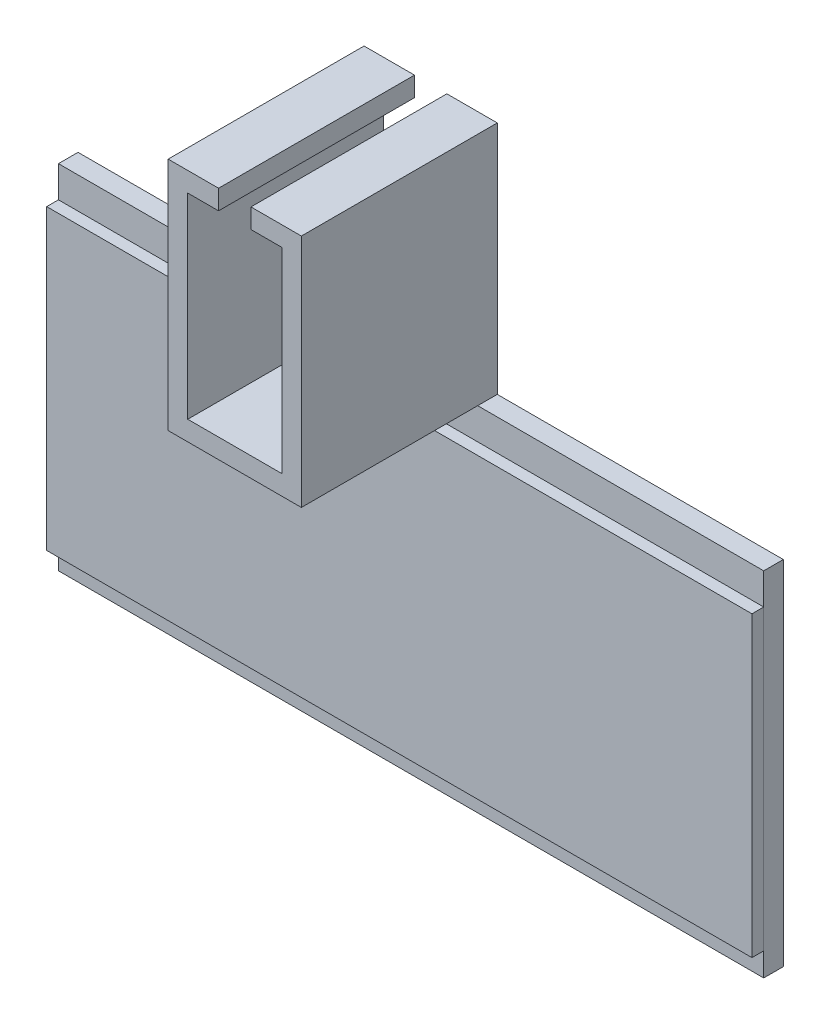
ISO-10303-21;
HEADER;
FILE_DESCRIPTION(('STEP AP214'),'2;1');
FILE_NAME('part.step','',(''),(''),'','','');
FILE_SCHEMA(('AUTOMOTIVE_DESIGN { 1 0 10303 214 1 1 1 1 }'));
ENDSEC;
DATA;
#1=APPLICATION_CONTEXT('core data for automotive mechanical design processes');
#2=APPLICATION_PROTOCOL_DEFINITION('international standard','automotive_design',2000,#1);
#3=PRODUCT_CONTEXT('',#1,'mechanical');
#4=PRODUCT('Part','Part','',(#3));
#5=PRODUCT_RELATED_PRODUCT_CATEGORY('part','',(#4));
#6=PRODUCT_DEFINITION_FORMATION('','',#4);
#7=PRODUCT_DEFINITION_CONTEXT('part definition',#1,'design');
#8=PRODUCT_DEFINITION('design','',#6,#7);
#9=PRODUCT_DEFINITION_SHAPE('','',#8);
#10=(LENGTH_UNIT() NAMED_UNIT(*) SI_UNIT(.MILLI.,.METRE.));
#11=(NAMED_UNIT(*) PLANE_ANGLE_UNIT() SI_UNIT($,.RADIAN.));
#12=(NAMED_UNIT(*) SI_UNIT($,.STERADIAN.) SOLID_ANGLE_UNIT());
#13=UNCERTAINTY_MEASURE_WITH_UNIT(LENGTH_MEASURE(1.E-05),#10,'distance_accuracy_value','');
#14=(GEOMETRIC_REPRESENTATION_CONTEXT(3) GLOBAL_UNCERTAINTY_ASSIGNED_CONTEXT((#13)) GLOBAL_UNIT_ASSIGNED_CONTEXT((#10,
#11,#12)) REPRESENTATION_CONTEXT('',''));
#15=CARTESIAN_POINT('',(0.,0.,0.));
#16=DIRECTION('',(0.,0.,1.));
#17=DIRECTION('',(1.,0.,0.));
#18=AXIS2_PLACEMENT_3D('',#15,#16,#17);
#19=CARTESIAN_POINT('',(-900.000000000001,-130.,49.9999999999999));
#20=DIRECTION('',(0.,0.,-1.));
#21=DIRECTION('',(0.,1.,0.));
#22=AXIS2_PLACEMENT_3D('',#19,#20,#21);
#23=PLANE('',#22);
#24=DIRECTION('',(0.,1.,0.));
#25=VECTOR('',#24,1.);
#26=CARTESIAN_POINT('',(900.,-130.,49.9999999999999));
#27=LINE('',#26,#25);
#28=CARTESIAN_POINT('',(900.,-890.,49.9999999999998));
#29=VERTEX_POINT('',#28);
#30=CARTESIAN_POINT('',(900.,-130.,49.9999999999999));
#31=VERTEX_POINT('',#30);
#32=EDGE_CURVE('E113',#29,#31,#27,.T.);
#33=ORIENTED_EDGE('',*,*,#32,.F.);
#34=DIRECTION('',(1.,0.,0.));
#35=VECTOR('',#34,1.);
#36=CARTESIAN_POINT('',(-900.000000000001,-890.,49.9999999999998));
#37=LINE('',#36,#35);
#38=CARTESIAN_POINT('',(-900.000000000001,-890.,49.9999999999998));
#39=VERTEX_POINT('',#38);
#40=EDGE_CURVE('E12',#39,#29,#37,.T.);
#41=ORIENTED_EDGE('',*,*,#40,.F.);
#42=DIRECTION('',(0.,1.,0.));
#43=VECTOR('',#42,1.);
#44=CARTESIAN_POINT('',(-900.000000000001,-130.,49.9999999999999));
#45=LINE('',#44,#43);
#46=CARTESIAN_POINT('',(-900.000000000001,-130.,49.9999999999999));
#47=VERTEX_POINT('',#46);
#48=EDGE_CURVE('E107',#39,#47,#45,.T.);
#49=ORIENTED_EDGE('',*,*,#48,.T.);
#50=DIRECTION('',(1.,0.,0.));
#51=VECTOR('',#50,1.);
#52=CARTESIAN_POINT('',(-900.000000000001,-130.,49.9999999999999));
#53=LINE('',#52,#51);
#54=EDGE_CURVE('E52',#47,#31,#53,.T.);
#55=ORIENTED_EDGE('',*,*,#54,.T.);
#56=EDGE_LOOP('',(#33,#41,#49,#55));
#57=FACE_BOUND('',#56,.T.);
#58=ADVANCED_FACE('F49',(#57),#23,.T.);
#59=CARTESIAN_POINT('',(-900.000000000001,-890.,49.9999999999998));
#60=DIRECTION('',(0.,-1.,0.));
#61=DIRECTION('',(0.,0.,-1.));
#62=AXIS2_PLACEMENT_3D('',#59,#60,#61);
#63=PLANE('',#62);
#64=DIRECTION('',(0.,0.,-1.));
#65=VECTOR('',#64,1.);
#66=CARTESIAN_POINT('',(900.,-890.,49.9999999999998));
#67=LINE('',#66,#65);
#68=CARTESIAN_POINT('',(900.,-890.,79.9999999999998));
#69=VERTEX_POINT('',#68);
#70=EDGE_CURVE('E109',#69,#29,#67,.T.);
#71=ORIENTED_EDGE('',*,*,#70,.F.);
#72=DIRECTION('',(1.,0.,0.));
#73=VECTOR('',#72,1.);
#74=CARTESIAN_POINT('',(-900.000000000001,-890.,79.9999999999998));
#75=LINE('',#74,#73);
#76=CARTESIAN_POINT('',(-900.000000000001,-890.,79.9999999999998));
#77=VERTEX_POINT('',#76);
#78=EDGE_CURVE('E58',#77,#69,#75,.T.);
#79=ORIENTED_EDGE('',*,*,#78,.F.);
#80=DIRECTION('',(0.,0.,-1.));
#81=VECTOR('',#80,1.);
#82=CARTESIAN_POINT('',(-900.000000000001,-890.,49.9999999999998));
#83=LINE('',#82,#81);
#84=EDGE_CURVE('E104',#77,#39,#83,.T.);
#85=ORIENTED_EDGE('',*,*,#84,.T.);
#86=ORIENTED_EDGE('',*,*,#40,.T.);
#87=EDGE_LOOP('',(#71,#79,#85,#86));
#88=FACE_BOUND('',#87,.T.);
#89=ADVANCED_FACE('F123',(#88),#63,.T.);
#90=CARTESIAN_POINT('',(-900.000000000001,-130.,79.9999999999999));
#91=DIRECTION('',(0.,0.,1.));
#92=DIRECTION('',(0.,-1.,0.));
#93=AXIS2_PLACEMENT_3D('',#90,#91,#92);
#94=PLANE('',#93);
#95=DIRECTION('',(0.,-1.,0.));
#96=VECTOR('',#95,1.);
#97=CARTESIAN_POINT('',(900.,-130.,79.9999999999999));
#98=LINE('',#97,#96);
#99=CARTESIAN_POINT('',(900.,-130.,79.9999999999999));
#100=VERTEX_POINT('',#99);
#101=EDGE_CURVE('E99',#100,#69,#98,.T.);
#102=ORIENTED_EDGE('',*,*,#101,.F.);
#103=DIRECTION('',(1.,0.,0.));
#104=VECTOR('',#103,1.);
#105=CARTESIAN_POINT('',(-900.000000000001,-130.,79.9999999999999));
#106=LINE('',#105,#104);
#107=CARTESIAN_POINT('',(-900.000000000001,-130.,79.9999999999999));
#108=VERTEX_POINT('',#107);
#109=EDGE_CURVE('E94',#108,#100,#106,.T.);
#110=ORIENTED_EDGE('',*,*,#109,.F.);
#111=DIRECTION('',(0.,-1.,0.));
#112=VECTOR('',#111,1.);
#113=CARTESIAN_POINT('',(-900.000000000001,-130.,79.9999999999999));
#114=LINE('',#113,#112);
#115=EDGE_CURVE('E97',#108,#77,#114,.T.);
#116=ORIENTED_EDGE('',*,*,#115,.T.);
#117=ORIENTED_EDGE('',*,*,#78,.T.);
#118=EDGE_LOOP('',(#102,#110,#116,#117));
#119=FACE_BOUND('',#118,.T.);
#120=ADVANCED_FACE('F96',(#119),#94,.T.);
#121=CARTESIAN_POINT('',(-900.000000000001,-130.,49.9999999999999));
#122=DIRECTION('',(0.,1.,0.));
#123=DIRECTION('',(-1.,0.,0.));
#124=AXIS2_PLACEMENT_3D('',#121,#122,#123);
#125=PLANE('',#124);
#126=DIRECTION('',(0.,0.,1.));
#127=VECTOR('',#126,1.);
#128=CARTESIAN_POINT('',(900.,-130.,49.9999999999999));
#129=LINE('',#128,#127);
#130=EDGE_CURVE('E116',#31,#100,#129,.T.);
#131=ORIENTED_EDGE('',*,*,#130,.F.);
#132=ORIENTED_EDGE('',*,*,#54,.F.);
#133=DIRECTION('',(0.,0.,1.));
#134=VECTOR('',#133,1.);
#135=CARTESIAN_POINT('',(-900.000000000001,-130.,49.9999999999999));
#136=LINE('',#135,#134);
#137=EDGE_CURVE('E103',#47,#108,#136,.T.);
#138=ORIENTED_EDGE('',*,*,#137,.T.);
#139=ORIENTED_EDGE('',*,*,#109,.T.);
#140=EDGE_LOOP('',(#131,#132,#138,#139));
#141=FACE_BOUND('',#140,.T.);
#142=ADVANCED_FACE('F106',(#141),#125,.T.);
#143=CARTESIAN_POINT('',(-900.000000000001,0.,0.));
#144=DIRECTION('',(-1.,0.,0.));
#145=DIRECTION('',(0.,-1.,0.));
#146=AXIS2_PLACEMENT_3D('',#143,#144,#145);
#147=PLANE('',#146);
#148=ORIENTED_EDGE('',*,*,#48,.F.);
#149=ORIENTED_EDGE('',*,*,#84,.F.);
#150=ORIENTED_EDGE('',*,*,#115,.F.);
#151=ORIENTED_EDGE('',*,*,#137,.F.);
#152=EDGE_LOOP('',(#148,#149,#150,#151));
#153=FACE_BOUND('',#152,.T.);
#154=ADVANCED_FACE('F102',(#153),#147,.T.);
#155=CARTESIAN_POINT('',(900.,1.31473779231926E-13,0.));
#156=DIRECTION('',(-1.,0.,0.));
#157=DIRECTION('',(0.,-1.,0.));
#158=AXIS2_PLACEMENT_3D('',#155,#156,#157);
#159=PLANE('',#158);
#160=ORIENTED_EDGE('',*,*,#32,.T.);
#161=ORIENTED_EDGE('',*,*,#130,.T.);
#162=ORIENTED_EDGE('',*,*,#101,.T.);
#163=ORIENTED_EDGE('',*,*,#70,.T.);
#164=EDGE_LOOP('',(#160,#161,#162,#163));
#165=FACE_BOUND('',#164,.T.);
#166=ADVANCED_FACE('F122',(#165),#159,.F.);
#167=CLOSED_SHELL('',(#58,#89,#120,#142,#154,#166));
#168=MANIFOLD_SOLID_BREP('B2',#167);
#169=CARTESIAN_POINT('',(120.,0.,500.));
#170=DIRECTION('',(1.,0.,0.));
#171=DIRECTION('',(0.,0.,-1.));
#172=AXIS2_PLACEMENT_3D('',#169,#170,#171);
#173=PLANE('',#172);
#174=DIRECTION('',(0.,-1.,0.));
#175=VECTOR('',#174,1.);
#176=CARTESIAN_POINT('',(120.,0.,0.));
#177=LINE('',#176,#175);
#178=CARTESIAN_POINT('',(120.,500.,0.));
#179=VERTEX_POINT('',#178);
#180=CARTESIAN_POINT('',(120.,0.,0.));
#181=VERTEX_POINT('',#180);
#182=EDGE_CURVE('E306',#179,#181,#177,.T.);
#183=ORIENTED_EDGE('',*,*,#182,.T.);
#184=DIRECTION('',(0.,0.,-1.));
#185=VECTOR('',#184,1.);
#186=CARTESIAN_POINT('',(120.,0.,500.));
#187=LINE('',#186,#185);
#188=CARTESIAN_POINT('',(120.,0.,500.));
#189=VERTEX_POINT('',#188);
#190=EDGE_CURVE('E180',#189,#181,#187,.T.);
#191=ORIENTED_EDGE('',*,*,#190,.F.);
#192=DIRECTION('',(0.,-1.,0.));
#193=VECTOR('',#192,1.);
#194=CARTESIAN_POINT('',(120.,0.,500.));
#195=LINE('',#194,#193);
#196=CARTESIAN_POINT('',(120.,500.,500.));
#197=VERTEX_POINT('',#196);
#198=EDGE_CURVE('E343',#197,#189,#195,.T.);
#199=ORIENTED_EDGE('',*,*,#198,.F.);
#200=DIRECTION('',(0.,0.,-1.));
#201=VECTOR('',#200,1.);
#202=CARTESIAN_POINT('',(120.,500.,500.));
#203=LINE('',#202,#201);
#204=EDGE_CURVE('E302',#197,#179,#203,.T.);
#205=ORIENTED_EDGE('',*,*,#204,.T.);
#206=EDGE_LOOP('',(#183,#191,#199,#205));
#207=FACE_BOUND('',#206,.T.);
#208=ADVANCED_FACE('F172',(#207),#173,.F.);
#209=CARTESIAN_POINT('',(-120.,0.,500.));
#210=DIRECTION('',(0.,-1.,0.));
#211=DIRECTION('',(0.,0.,-1.));
#212=AXIS2_PLACEMENT_3D('',#209,#210,#211);
#213=PLANE('',#212);
#214=DIRECTION('',(-1.,0.,0.));
#215=VECTOR('',#214,1.);
#216=CARTESIAN_POINT('',(-120.,0.,0.));
#217=LINE('',#216,#215);
#218=CARTESIAN_POINT('',(-120.,0.,0.));
#219=VERTEX_POINT('',#218);
#220=EDGE_CURVE('E309',#181,#219,#217,.T.);
#221=ORIENTED_EDGE('',*,*,#220,.T.);
#222=DIRECTION('',(0.,0.,-1.));
#223=VECTOR('',#222,1.);
#224=CARTESIAN_POINT('',(-120.,0.,500.));
#225=LINE('',#224,#223);
#226=CARTESIAN_POINT('',(-120.,0.,500.));
#227=VERTEX_POINT('',#226);
#228=EDGE_CURVE('E375',#227,#219,#225,.T.);
#229=ORIENTED_EDGE('',*,*,#228,.F.);
#230=DIRECTION('',(-1.,0.,0.));
#231=VECTOR('',#230,1.);
#232=CARTESIAN_POINT('',(-120.,0.,500.));
#233=LINE('',#232,#231);
#234=EDGE_CURVE('E257',#189,#227,#233,.T.);
#235=ORIENTED_EDGE('',*,*,#234,.F.);
#236=ORIENTED_EDGE('',*,*,#190,.T.);
#237=EDGE_LOOP('',(#221,#229,#235,#236));
#238=FACE_BOUND('',#237,.T.);
#239=ADVANCED_FACE('F378',(#238),#213,.F.);
#240=CARTESIAN_POINT('',(-120.,0.,500.));
#241=DIRECTION('',(-1.,0.,0.));
#242=DIRECTION('',(0.,0.,1.));
#243=AXIS2_PLACEMENT_3D('',#240,#241,#242);
#244=PLANE('',#243);
#245=DIRECTION('',(0.,1.,0.));
#246=VECTOR('',#245,1.);
#247=CARTESIAN_POINT('',(-120.,0.,0.));
#248=LINE('',#247,#246);
#249=CARTESIAN_POINT('',(-120.,500.,0.));
#250=VERTEX_POINT('',#249);
#251=EDGE_CURVE('E312',#219,#250,#248,.T.);
#252=ORIENTED_EDGE('',*,*,#251,.T.);
#253=DIRECTION('',(0.,0.,-1.));
#254=VECTOR('',#253,1.);
#255=CARTESIAN_POINT('',(-120.,500.,500.));
#256=LINE('',#255,#254);
#257=CARTESIAN_POINT('',(-120.,500.,500.));
#258=VERTEX_POINT('',#257);
#259=EDGE_CURVE('E372',#258,#250,#256,.T.);
#260=ORIENTED_EDGE('',*,*,#259,.F.);
#261=DIRECTION('',(0.,1.,0.));
#262=VECTOR('',#261,1.);
#263=CARTESIAN_POINT('',(-120.,0.,500.));
#264=LINE('',#263,#262);
#265=EDGE_CURVE('E398',#227,#258,#264,.T.);
#266=ORIENTED_EDGE('',*,*,#265,.F.);
#267=ORIENTED_EDGE('',*,*,#228,.T.);
#268=EDGE_LOOP('',(#252,#260,#266,#267));
#269=FACE_BOUND('',#268,.T.);
#270=ADVANCED_FACE('F389',(#269),#244,.F.);
#271=CARTESIAN_POINT('',(-120.,500.,500.));
#272=DIRECTION('',(0.,1.,0.));
#273=DIRECTION('',(-1.,0.,0.));
#274=AXIS2_PLACEMENT_3D('',#271,#272,#273);
#275=PLANE('',#274);
#276=DIRECTION('',(1.,0.,0.));
#277=VECTOR('',#276,1.);
#278=CARTESIAN_POINT('',(-120.,500.,0.));
#279=LINE('',#278,#277);
#280=CARTESIAN_POINT('',(-41.3483146067419,500.,0.));
#281=VERTEX_POINT('',#280);
#282=EDGE_CURVE('E314',#250,#281,#279,.T.);
#283=ORIENTED_EDGE('',*,*,#282,.T.);
#284=DIRECTION('',(0.,0.,-1.));
#285=VECTOR('',#284,1.);
#286=CARTESIAN_POINT('',(-41.3483146067419,500.,500.));
#287=LINE('',#286,#285);
#288=CARTESIAN_POINT('',(-41.3483146067419,500.,500.));
#289=VERTEX_POINT('',#288);
#290=EDGE_CURVE('E369',#289,#281,#287,.T.);
#291=ORIENTED_EDGE('',*,*,#290,.F.);
#292=DIRECTION('',(1.,0.,0.));
#293=VECTOR('',#292,1.);
#294=CARTESIAN_POINT('',(-120.,500.,500.));
#295=LINE('',#294,#293);
#296=EDGE_CURVE('E395',#258,#289,#295,.T.);
#297=ORIENTED_EDGE('',*,*,#296,.F.);
#298=ORIENTED_EDGE('',*,*,#259,.T.);
#299=EDGE_LOOP('',(#283,#291,#297,#298));
#300=FACE_BOUND('',#299,.T.);
#301=ADVANCED_FACE('F393',(#300),#275,.F.);
#302=CARTESIAN_POINT('',(-41.3483146067419,500.,500.));
#303=DIRECTION('',(-1.,0.,0.));
#304=DIRECTION('',(0.,0.,1.));
#305=AXIS2_PLACEMENT_3D('',#302,#303,#304);
#306=PLANE('',#305);
#307=DIRECTION('',(0.,1.,0.));
#308=VECTOR('',#307,1.);
#309=CARTESIAN_POINT('',(-41.3483146067419,500.,0.));
#310=LINE('',#309,#308);
#311=CARTESIAN_POINT('',(-41.3483146067419,550.,0.));
#312=VERTEX_POINT('',#311);
#313=EDGE_CURVE('E316',#281,#312,#310,.T.);
#314=ORIENTED_EDGE('',*,*,#313,.T.);
#315=DIRECTION('',(0.,0.,-1.));
#316=VECTOR('',#315,1.);
#317=CARTESIAN_POINT('',(-41.3483146067419,550.,500.));
#318=LINE('',#317,#316);
#319=CARTESIAN_POINT('',(-41.3483146067419,550.,500.));
#320=VERTEX_POINT('',#319);
#321=EDGE_CURVE('E366',#320,#312,#318,.T.);
#322=ORIENTED_EDGE('',*,*,#321,.F.);
#323=DIRECTION('',(0.,1.,0.));
#324=VECTOR('',#323,1.);
#325=CARTESIAN_POINT('',(-41.3483146067419,500.,500.));
#326=LINE('',#325,#324);
#327=EDGE_CURVE('E397',#289,#320,#326,.T.);
#328=ORIENTED_EDGE('',*,*,#327,.F.);
#329=ORIENTED_EDGE('',*,*,#290,.T.);
#330=EDGE_LOOP('',(#314,#322,#328,#329));
#331=FACE_BOUND('',#330,.T.);
#332=ADVANCED_FACE('F490',(#331),#306,.F.);
#333=CARTESIAN_POINT('',(-41.3483146067419,550.,500.));
#334=DIRECTION('',(0.,-1.,0.));
#335=DIRECTION('',(0.,0.,-1.));
#336=AXIS2_PLACEMENT_3D('',#333,#334,#335);
#337=PLANE('',#336);
#338=DIRECTION('',(-1.,0.,0.));
#339=VECTOR('',#338,1.);
#340=CARTESIAN_POINT('',(-41.3483146067419,550.,0.));
#341=LINE('',#340,#339);
#342=CARTESIAN_POINT('',(-170.,550.,0.));
#343=VERTEX_POINT('',#342);
#344=EDGE_CURVE('E318',#312,#343,#341,.T.);
#345=ORIENTED_EDGE('',*,*,#344,.T.);
#346=DIRECTION('',(0.,0.,-1.));
#347=VECTOR('',#346,1.);
#348=CARTESIAN_POINT('',(-170.,550.,500.));
#349=LINE('',#348,#347);
#350=CARTESIAN_POINT('',(-170.,550.,500.));
#351=VERTEX_POINT('',#350);
#352=EDGE_CURVE('E363',#351,#343,#349,.T.);
#353=ORIENTED_EDGE('',*,*,#352,.F.);
#354=DIRECTION('',(-1.,0.,0.));
#355=VECTOR('',#354,1.);
#356=CARTESIAN_POINT('',(-41.3483146067419,550.,500.));
#357=LINE('',#356,#355);
#358=EDGE_CURVE('E400',#320,#351,#357,.T.);
#359=ORIENTED_EDGE('',*,*,#358,.F.);
#360=ORIENTED_EDGE('',*,*,#321,.T.);
#361=EDGE_LOOP('',(#345,#353,#359,#360));
#362=FACE_BOUND('',#361,.T.);
#363=ADVANCED_FACE('F493',(#362),#337,.F.);
#364=CARTESIAN_POINT('',(-170.,550.,500.));
#365=DIRECTION('',(1.,0.,0.));
#366=DIRECTION('',(0.,1.,0.));
#367=AXIS2_PLACEMENT_3D('',#364,#365,#366);
#368=PLANE('',#367);
#369=DIRECTION('',(0.,-1.,0.));
#370=VECTOR('',#369,1.);
#371=CARTESIAN_POINT('',(-170.,550.,0.));
#372=LINE('',#371,#370);
#373=CARTESIAN_POINT('',(-170.,-50.,0.));
#374=VERTEX_POINT('',#373);
#375=EDGE_CURVE('E320',#343,#374,#372,.T.);
#376=ORIENTED_EDGE('',*,*,#375,.T.);
#377=DIRECTION('',(0.,0.,-1.));
#378=VECTOR('',#377,1.);
#379=CARTESIAN_POINT('',(-170.,-50.,500.));
#380=LINE('',#379,#378);
#381=CARTESIAN_POINT('',(-170.,-49.9999999999996,50.));
#382=VERTEX_POINT('',#381);
#383=EDGE_CURVE('E359',#382,#374,#380,.T.);
#384=ORIENTED_EDGE('',*,*,#383,.F.);
#385=CARTESIAN_POINT('',(-170.,-49.9999999999996,500.));
#386=VERTEX_POINT('',#385);
#387=EDGE_CURVE('E360',#386,#382,#380,.T.);
#388=ORIENTED_EDGE('',*,*,#387,.F.);
#389=DIRECTION('',(0.,-1.,0.));
#390=VECTOR('',#389,1.);
#391=CARTESIAN_POINT('',(-170.,550.,500.));
#392=LINE('',#391,#390);
#393=EDGE_CURVE('E406',#351,#386,#392,.T.);
#394=ORIENTED_EDGE('',*,*,#393,.F.);
#395=ORIENTED_EDGE('',*,*,#352,.T.);
#396=EDGE_LOOP('',(#376,#384,#388,#394,#395));
#397=FACE_BOUND('',#396,.T.);
#398=ADVANCED_FACE('F415',(#397),#368,.F.);
#399=CARTESIAN_POINT('',(-170.,-50.,500.));
#400=DIRECTION('',(0.,-1.,0.));
#401=DIRECTION('',(0.,0.,-1.));
#402=AXIS2_PLACEMENT_3D('',#399,#400,#401);
#403=PLANE('',#402);
#404=DIRECTION('',(0.,0.,-1.));
#405=VECTOR('',#404,1.);
#406=CARTESIAN_POINT('',(-900.,-50.,500.));
#407=LINE('',#406,#405);
#408=CARTESIAN_POINT('',(-900.,-49.9999999999995,50.));
#409=VERTEX_POINT('',#408);
#410=CARTESIAN_POINT('',(-900.,-50.,0.));
#411=VERTEX_POINT('',#410);
#412=EDGE_CURVE('E357',#409,#411,#407,.T.);
#413=ORIENTED_EDGE('',*,*,#412,.F.);
#414=DIRECTION('',(1.,0.,0.));
#415=VECTOR('',#414,1.);
#416=CARTESIAN_POINT('',(-900.,-49.9999999999995,50.));
#417=LINE('',#416,#415);
#418=EDGE_CURVE('E310',#409,#382,#417,.T.);
#419=ORIENTED_EDGE('',*,*,#418,.T.);
#420=ORIENTED_EDGE('',*,*,#383,.T.);
#421=DIRECTION('',(-1.,0.,0.));
#422=VECTOR('',#421,1.);
#423=CARTESIAN_POINT('',(-170.,-50.,0.));
#424=LINE('',#423,#422);
#425=EDGE_CURVE('E323',#374,#411,#424,.T.);
#426=ORIENTED_EDGE('',*,*,#425,.T.);
#427=EDGE_LOOP('',(#413,#419,#420,#426));
#428=FACE_BOUND('',#427,.T.);
#429=ADVANCED_FACE('F438',(#428),#403,.F.);
#430=CARTESIAN_POINT('',(-900.,-50.,500.));
#431=DIRECTION('',(1.,0.,0.));
#432=DIRECTION('',(0.,1.,0.));
#433=AXIS2_PLACEMENT_3D('',#430,#431,#432);
#434=PLANE('',#433);
#435=DIRECTION('',(0.,0.,-1.));
#436=VECTOR('',#435,1.);
#437=CARTESIAN_POINT('',(-900.,-950.,500.));
#438=LINE('',#437,#436);
#439=CARTESIAN_POINT('',(-900.,-950.,49.9999999999999));
#440=VERTEX_POINT('',#439);
#441=CARTESIAN_POINT('',(-900.,-950.,0.));
#442=VERTEX_POINT('',#441);
#443=EDGE_CURVE('E355',#440,#442,#438,.T.);
#444=ORIENTED_EDGE('',*,*,#443,.F.);
#445=DIRECTION('',(0.,1.,0.));
#446=VECTOR('',#445,1.);
#447=CARTESIAN_POINT('',(-900.,-49.9999999999995,50.));
#448=LINE('',#447,#446);
#449=EDGE_CURVE('E446',#440,#409,#448,.T.);
#450=ORIENTED_EDGE('',*,*,#449,.T.);
#451=ORIENTED_EDGE('',*,*,#412,.T.);
#452=DIRECTION('',(0.,-1.,0.));
#453=VECTOR('',#452,1.);
#454=CARTESIAN_POINT('',(-900.,-50.,0.));
#455=LINE('',#454,#453);
#456=EDGE_CURVE('E326',#411,#442,#455,.T.);
#457=ORIENTED_EDGE('',*,*,#456,.T.);
#458=EDGE_LOOP('',(#444,#450,#451,#457));
#459=FACE_BOUND('',#458,.T.);
#460=ADVANCED_FACE('F502',(#459),#434,.F.);
#461=CARTESIAN_POINT('',(900.,-950.,500.));
#462=DIRECTION('',(0.,1.,0.));
#463=DIRECTION('',(-1.,0.,0.));
#464=AXIS2_PLACEMENT_3D('',#461,#462,#463);
#465=PLANE('',#464);
#466=DIRECTION('',(0.,0.,-1.));
#467=VECTOR('',#466,1.);
#468=CARTESIAN_POINT('',(900.,-950.,500.));
#469=LINE('',#468,#467);
#470=CARTESIAN_POINT('',(900.,-950.,49.9999999999999));
#471=VERTEX_POINT('',#470);
#472=CARTESIAN_POINT('',(900.,-950.,0.));
#473=VERTEX_POINT('',#472);
#474=EDGE_CURVE('E353',#471,#473,#469,.T.);
#475=ORIENTED_EDGE('',*,*,#474,.F.);
#476=DIRECTION('',(1.,0.,0.));
#477=VECTOR('',#476,1.);
#478=CARTESIAN_POINT('',(-900.,-950.,49.9999999999999));
#479=LINE('',#478,#477);
#480=EDGE_CURVE('E441',#440,#471,#479,.T.);
#481=ORIENTED_EDGE('',*,*,#480,.F.);
#482=ORIENTED_EDGE('',*,*,#443,.T.);
#483=DIRECTION('',(1.,0.,0.));
#484=VECTOR('',#483,1.);
#485=CARTESIAN_POINT('',(900.,-950.,0.));
#486=LINE('',#485,#484);
#487=EDGE_CURVE('E329',#442,#473,#486,.T.);
#488=ORIENTED_EDGE('',*,*,#487,.T.);
#489=EDGE_LOOP('',(#475,#481,#482,#488));
#490=FACE_BOUND('',#489,.T.);
#491=ADVANCED_FACE('F462',(#490),#465,.F.);
#492=CARTESIAN_POINT('',(900.,-50.,500.));
#493=DIRECTION('',(-1.,0.,0.));
#494=DIRECTION('',(0.,-1.,0.));
#495=AXIS2_PLACEMENT_3D('',#492,#493,#494);
#496=PLANE('',#495);
#497=DIRECTION('',(0.,0.,-1.));
#498=VECTOR('',#497,1.);
#499=CARTESIAN_POINT('',(900.,-50.,500.));
#500=LINE('',#499,#498);
#501=CARTESIAN_POINT('',(900.,-49.9999999999998,50.));
#502=VERTEX_POINT('',#501);
#503=CARTESIAN_POINT('',(900.,-50.,0.));
#504=VERTEX_POINT('',#503);
#505=EDGE_CURVE('E351',#502,#504,#500,.T.);
#506=ORIENTED_EDGE('',*,*,#505,.F.);
#507=DIRECTION('',(0.,1.,0.));
#508=VECTOR('',#507,1.);
#509=CARTESIAN_POINT('',(900.,-49.9999999999998,50.));
#510=LINE('',#509,#508);
#511=EDGE_CURVE('E450',#471,#502,#510,.T.);
#512=ORIENTED_EDGE('',*,*,#511,.F.);
#513=ORIENTED_EDGE('',*,*,#474,.T.);
#514=DIRECTION('',(0.,1.,0.));
#515=VECTOR('',#514,1.);
#516=CARTESIAN_POINT('',(900.,-50.,0.));
#517=LINE('',#516,#515);
#518=EDGE_CURVE('E332',#473,#504,#517,.T.);
#519=ORIENTED_EDGE('',*,*,#518,.T.);
#520=EDGE_LOOP('',(#506,#512,#513,#519));
#521=FACE_BOUND('',#520,.T.);
#522=ADVANCED_FACE('F459',(#521),#496,.F.);
#523=CARTESIAN_POINT('',(170.,-50.,500.));
#524=DIRECTION('',(0.,-1.,0.));
#525=DIRECTION('',(0.,0.,-1.));
#526=AXIS2_PLACEMENT_3D('',#523,#524,#525);
#527=PLANE('',#526);
#528=DIRECTION('',(0.,0.,-1.));
#529=VECTOR('',#528,1.);
#530=CARTESIAN_POINT('',(170.,-50.,500.));
#531=LINE('',#530,#529);
#532=CARTESIAN_POINT('',(170.,-49.9999999999997,50.));
#533=VERTEX_POINT('',#532);
#534=CARTESIAN_POINT('',(170.,-50.,0.));
#535=VERTEX_POINT('',#534);
#536=EDGE_CURVE('E347',#533,#535,#531,.T.);
#537=ORIENTED_EDGE('',*,*,#536,.F.);
#538=EDGE_CURVE('E434',#533,#502,#417,.T.);
#539=ORIENTED_EDGE('',*,*,#538,.T.);
#540=ORIENTED_EDGE('',*,*,#505,.T.);
#541=DIRECTION('',(-1.,0.,0.));
#542=VECTOR('',#541,1.);
#543=CARTESIAN_POINT('',(170.,-50.,0.));
#544=LINE('',#543,#542);
#545=EDGE_CURVE('E335',#504,#535,#544,.T.);
#546=ORIENTED_EDGE('',*,*,#545,.T.);
#547=EDGE_LOOP('',(#537,#539,#540,#546));
#548=FACE_BOUND('',#547,.T.);
#549=ADVANCED_FACE('F468',(#548),#527,.F.);
#550=CARTESIAN_POINT('',(170.,550.,500.));
#551=DIRECTION('',(-1.,0.,0.));
#552=DIRECTION('',(0.,-1.,0.));
#553=AXIS2_PLACEMENT_3D('',#550,#551,#552);
#554=PLANE('',#553);
#555=DIRECTION('',(0.,1.,0.));
#556=VECTOR('',#555,1.);
#557=CARTESIAN_POINT('',(170.,550.,0.));
#558=LINE('',#557,#556);
#559=CARTESIAN_POINT('',(170.,550.,0.));
#560=VERTEX_POINT('',#559);
#561=EDGE_CURVE('E338',#535,#560,#558,.T.);
#562=ORIENTED_EDGE('',*,*,#561,.T.);
#563=DIRECTION('',(0.,0.,-1.));
#564=VECTOR('',#563,1.);
#565=CARTESIAN_POINT('',(170.,550.,500.));
#566=LINE('',#565,#564);
#567=CARTESIAN_POINT('',(170.,550.,500.));
#568=VERTEX_POINT('',#567);
#569=EDGE_CURVE('E297',#568,#560,#566,.T.);
#570=ORIENTED_EDGE('',*,*,#569,.F.);
#571=DIRECTION('',(0.,1.,0.));
#572=VECTOR('',#571,1.);
#573=CARTESIAN_POINT('',(170.,550.,500.));
#574=LINE('',#573,#572);
#575=CARTESIAN_POINT('',(170.,-50.,500.));
#576=VERTEX_POINT('',#575);
#577=EDGE_CURVE('E288',#576,#568,#574,.T.);
#578=ORIENTED_EDGE('',*,*,#577,.F.);
#579=EDGE_CURVE('E348',#576,#533,#531,.T.);
#580=ORIENTED_EDGE('',*,*,#579,.T.);
#581=ORIENTED_EDGE('',*,*,#536,.T.);
#582=EDGE_LOOP('',(#562,#570,#578,#580,#581));
#583=FACE_BOUND('',#582,.T.);
#584=ADVANCED_FACE('F470',(#583),#554,.F.);
#585=CARTESIAN_POINT('',(41.3483146067419,550.,500.));
#586=DIRECTION('',(0.,-1.,0.));
#587=DIRECTION('',(0.,0.,-1.));
#588=AXIS2_PLACEMENT_3D('',#585,#586,#587);
#589=PLANE('',#588);
#590=DIRECTION('',(-1.,0.,0.));
#591=VECTOR('',#590,1.);
#592=CARTESIAN_POINT('',(41.3483146067419,550.,0.));
#593=LINE('',#592,#591);
#594=CARTESIAN_POINT('',(41.3483146067419,550.,0.));
#595=VERTEX_POINT('',#594);
#596=EDGE_CURVE('E296',#560,#595,#593,.T.);
#597=ORIENTED_EDGE('',*,*,#596,.T.);
#598=DIRECTION('',(0.,0.,-1.));
#599=VECTOR('',#598,1.);
#600=CARTESIAN_POINT('',(41.3483146067419,550.,500.));
#601=LINE('',#600,#599);
#602=CARTESIAN_POINT('',(41.3483146067419,550.,500.));
#603=VERTEX_POINT('',#602);
#604=EDGE_CURVE('E293',#603,#595,#601,.T.);
#605=ORIENTED_EDGE('',*,*,#604,.F.);
#606=DIRECTION('',(-1.,0.,0.));
#607=VECTOR('',#606,1.);
#608=CARTESIAN_POINT('',(41.3483146067419,550.,500.));
#609=LINE('',#608,#607);
#610=EDGE_CURVE('E281',#568,#603,#609,.T.);
#611=ORIENTED_EDGE('',*,*,#610,.F.);
#612=ORIENTED_EDGE('',*,*,#569,.T.);
#613=EDGE_LOOP('',(#597,#605,#611,#612));
#614=FACE_BOUND('',#613,.T.);
#615=ADVANCED_FACE('F294',(#614),#589,.F.);
#616=CARTESIAN_POINT('',(41.3483146067419,500.,500.));
#617=DIRECTION('',(1.,0.,0.));
#618=DIRECTION('',(0.,0.,-1.));
#619=AXIS2_PLACEMENT_3D('',#616,#617,#618);
#620=PLANE('',#619);
#621=DIRECTION('',(0.,-1.,0.));
#622=VECTOR('',#621,1.);
#623=CARTESIAN_POINT('',(41.3483146067419,500.,0.));
#624=LINE('',#623,#622);
#625=CARTESIAN_POINT('',(41.3483146067419,500.,0.));
#626=VERTEX_POINT('',#625);
#627=EDGE_CURVE('E242',#595,#626,#624,.T.);
#628=ORIENTED_EDGE('',*,*,#627,.T.);
#629=DIRECTION('',(0.,0.,-1.));
#630=VECTOR('',#629,1.);
#631=CARTESIAN_POINT('',(41.3483146067419,500.,500.));
#632=LINE('',#631,#630);
#633=CARTESIAN_POINT('',(41.3483146067419,500.,500.));
#634=VERTEX_POINT('',#633);
#635=EDGE_CURVE('E298',#634,#626,#632,.T.);
#636=ORIENTED_EDGE('',*,*,#635,.F.);
#637=DIRECTION('',(0.,-1.,0.));
#638=VECTOR('',#637,1.);
#639=CARTESIAN_POINT('',(41.3483146067419,500.,500.));
#640=LINE('',#639,#638);
#641=EDGE_CURVE('E286',#603,#634,#640,.T.);
#642=ORIENTED_EDGE('',*,*,#641,.F.);
#643=ORIENTED_EDGE('',*,*,#604,.T.);
#644=EDGE_LOOP('',(#628,#636,#642,#643));
#645=FACE_BOUND('',#644,.T.);
#646=ADVANCED_FACE('F300',(#645),#620,.F.);
#647=CARTESIAN_POINT('',(120.,500.,500.));
#648=DIRECTION('',(0.,1.,0.));
#649=DIRECTION('',(-1.,0.,0.));
#650=AXIS2_PLACEMENT_3D('',#647,#648,#649);
#651=PLANE('',#650);
#652=DIRECTION('',(1.,0.,0.));
#653=VECTOR('',#652,1.);
#654=CARTESIAN_POINT('',(120.,500.,0.));
#655=LINE('',#654,#653);
#656=EDGE_CURVE('E248',#626,#179,#655,.T.);
#657=ORIENTED_EDGE('',*,*,#656,.T.);
#658=ORIENTED_EDGE('',*,*,#204,.F.);
#659=DIRECTION('',(1.,0.,0.));
#660=VECTOR('',#659,1.);
#661=CARTESIAN_POINT('',(120.,500.,500.));
#662=LINE('',#661,#660);
#663=EDGE_CURVE('E188',#634,#197,#662,.T.);
#664=ORIENTED_EDGE('',*,*,#663,.F.);
#665=ORIENTED_EDGE('',*,*,#635,.T.);
#666=EDGE_LOOP('',(#657,#658,#664,#665));
#667=FACE_BOUND('',#666,.T.);
#668=ADVANCED_FACE('F530',(#667),#651,.F.);
#669=CARTESIAN_POINT('',(0.,0.,500.));
#670=DIRECTION('',(0.,0.,1.));
#671=DIRECTION('',(1.,0.,0.));
#672=AXIS2_PLACEMENT_3D('',#669,#670,#671);
#673=PLANE('',#672);
#674=DIRECTION('',(-1.,0.,0.));
#675=VECTOR('',#674,1.);
#676=CARTESIAN_POINT('',(0.,-49.9999999999996,500.));
#677=LINE('',#676,#675);
#678=EDGE_CURVE('E47',#576,#386,#677,.T.);
#679=ORIENTED_EDGE('',*,*,#678,.F.);
#680=ORIENTED_EDGE('',*,*,#577,.T.);
#681=ORIENTED_EDGE('',*,*,#610,.T.);
#682=ORIENTED_EDGE('',*,*,#641,.T.);
#683=ORIENTED_EDGE('',*,*,#663,.T.);
#684=ORIENTED_EDGE('',*,*,#198,.T.);
#685=ORIENTED_EDGE('',*,*,#234,.T.);
#686=ORIENTED_EDGE('',*,*,#265,.T.);
#687=ORIENTED_EDGE('',*,*,#296,.T.);
#688=ORIENTED_EDGE('',*,*,#327,.T.);
#689=ORIENTED_EDGE('',*,*,#358,.T.);
#690=ORIENTED_EDGE('',*,*,#393,.T.);
#691=EDGE_LOOP('',(#679,#680,#681,#682,#683,#684,#685,#686,#687,#688,#689,#690));
#692=FACE_BOUND('',#691,.T.);
#693=ADVANCED_FACE('F284',(#692),#673,.T.);
#694=CARTESIAN_POINT('',(0.,0.,0.));
#695=DIRECTION('',(0.,0.,1.));
#696=DIRECTION('',(1.,0.,0.));
#697=AXIS2_PLACEMENT_3D('',#694,#695,#696);
#698=PLANE('',#697);
#699=ORIENTED_EDGE('',*,*,#182,.F.);
#700=ORIENTED_EDGE('',*,*,#656,.F.);
#701=ORIENTED_EDGE('',*,*,#627,.F.);
#702=ORIENTED_EDGE('',*,*,#596,.F.);
#703=ORIENTED_EDGE('',*,*,#561,.F.);
#704=ORIENTED_EDGE('',*,*,#545,.F.);
#705=ORIENTED_EDGE('',*,*,#518,.F.);
#706=ORIENTED_EDGE('',*,*,#487,.F.);
#707=ORIENTED_EDGE('',*,*,#456,.F.);
#708=ORIENTED_EDGE('',*,*,#425,.F.);
#709=ORIENTED_EDGE('',*,*,#375,.F.);
#710=ORIENTED_EDGE('',*,*,#344,.F.);
#711=ORIENTED_EDGE('',*,*,#313,.F.);
#712=ORIENTED_EDGE('',*,*,#282,.F.);
#713=ORIENTED_EDGE('',*,*,#251,.F.);
#714=ORIENTED_EDGE('',*,*,#220,.F.);
#715=EDGE_LOOP('',(#699,#700,#701,#702,#703,#704,#705,#706,#707,#708,#709,#710,#711,#712,#713,#714));
#716=FACE_BOUND('',#715,.T.);
#717=ADVANCED_FACE('F383',(#716),#698,.F.);
#718=CARTESIAN_POINT('',(-900.,-49.9999999999995,500.));
#719=DIRECTION('',(0.,1.,0.));
#720=DIRECTION('',(-1.,0.,0.));
#721=AXIS2_PLACEMENT_3D('',#718,#719,#720);
#722=PLANE('',#721);
#723=EDGE_CURVE('E421',#382,#533,#417,.T.);
#724=ORIENTED_EDGE('',*,*,#723,.T.);
#725=ORIENTED_EDGE('',*,*,#579,.F.);
#726=ORIENTED_EDGE('',*,*,#678,.T.);
#727=ORIENTED_EDGE('',*,*,#387,.T.);
#728=EDGE_LOOP('',(#724,#725,#726,#727));
#729=FACE_BOUND('',#728,.T.);
#730=ADVANCED_FACE('F420',(#729),#722,.F.);
#731=CARTESIAN_POINT('',(-900.,-49.9999999999995,50.));
#732=DIRECTION('',(0.,0.,-1.));
#733=DIRECTION('',(0.,1.,0.));
#734=AXIS2_PLACEMENT_3D('',#731,#732,#733);
#735=PLANE('',#734);
#736=ORIENTED_EDGE('',*,*,#511,.T.);
#737=ORIENTED_EDGE('',*,*,#538,.F.);
#738=ORIENTED_EDGE('',*,*,#723,.F.);
#739=ORIENTED_EDGE('',*,*,#418,.F.);
#740=ORIENTED_EDGE('',*,*,#449,.F.);
#741=ORIENTED_EDGE('',*,*,#480,.T.);
#742=EDGE_LOOP('',(#736,#737,#738,#739,#740,#741));
#743=FACE_BOUND('',#742,.T.);
#744=ADVANCED_FACE('F430',(#743),#735,.F.);
#745=CLOSED_SHELL('',(#208,#239,#270,#301,#332,#363,#398,#429,#460,#491,#522,#549,#584,#615,
#646,#668,#693,#717,#730,#744));
#746=MANIFOLD_SOLID_BREP('B6',#745);
#747=ADVANCED_BREP_SHAPE_REPRESENTATION('',(#18,#168,#746),#14);
#748=SHAPE_DEFINITION_REPRESENTATION(#9,#747);
ENDSEC;
END-ISO-10303-21;
